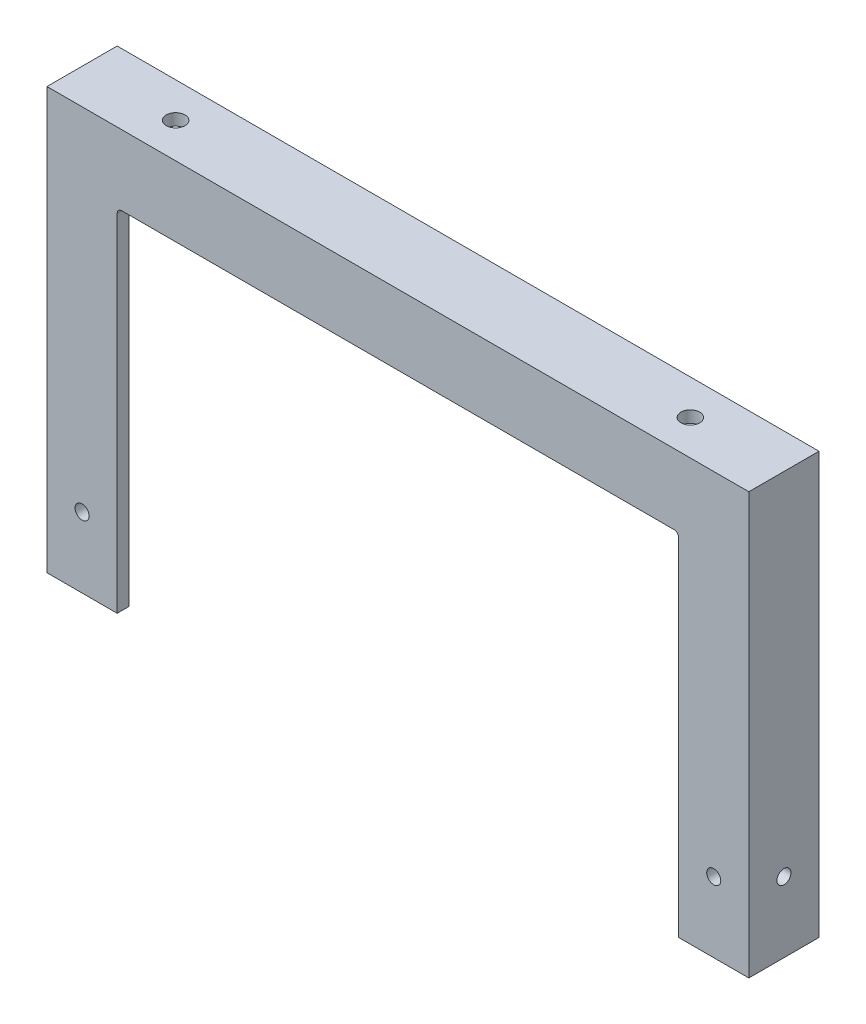
ISO-10303-21;
HEADER;
FILE_DESCRIPTION(('STEP AP214'),'2;1');
FILE_NAME('part.step','',(''),(''),'','','');
FILE_SCHEMA(('AUTOMOTIVE_DESIGN { 1 0 10303 214 1 1 1 1 }'));
ENDSEC;
DATA;
#1=APPLICATION_CONTEXT('core data for automotive mechanical design processes');
#2=APPLICATION_PROTOCOL_DEFINITION('international standard','automotive_design',2000,#1);
#3=PRODUCT_CONTEXT('',#1,'mechanical');
#4=PRODUCT('Part','Part','',(#3));
#5=PRODUCT_RELATED_PRODUCT_CATEGORY('part','',(#4));
#6=PRODUCT_DEFINITION_FORMATION('','',#4);
#7=PRODUCT_DEFINITION_CONTEXT('part definition',#1,'design');
#8=PRODUCT_DEFINITION('design','',#6,#7);
#9=PRODUCT_DEFINITION_SHAPE('','',#8);
#10=(LENGTH_UNIT() NAMED_UNIT(*) SI_UNIT(.MILLI.,.METRE.));
#11=(NAMED_UNIT(*) PLANE_ANGLE_UNIT() SI_UNIT($,.RADIAN.));
#12=(NAMED_UNIT(*) SI_UNIT($,.STERADIAN.) SOLID_ANGLE_UNIT());
#13=UNCERTAINTY_MEASURE_WITH_UNIT(LENGTH_MEASURE(1.E-05),#10,'distance_accuracy_value','');
#14=(GEOMETRIC_REPRESENTATION_CONTEXT(3) GLOBAL_UNCERTAINTY_ASSIGNED_CONTEXT((#13)) GLOBAL_UNIT_ASSIGNED_CONTEXT((#10,
#11,#12)) REPRESENTATION_CONTEXT('',''));
#15=CARTESIAN_POINT('',(0.,0.,0.));
#16=DIRECTION('',(0.,0.,1.));
#17=DIRECTION('',(1.,0.,0.));
#18=AXIS2_PLACEMENT_3D('',#15,#16,#17);
#19=CARTESIAN_POINT('',(30.,0.,25.));
#20=DIRECTION('',(0.,1.,0.));
#21=DIRECTION('',(0.,0.,1.));
#22=AXIS2_PLACEMENT_3D('',#19,#20,#21);
#23=PLANE('',#22);
#24=DIRECTION('',(0.,0.,-1.));
#25=VECTOR('',#24,1.);
#26=CARTESIAN_POINT('',(0.,0.,25.));
#27=LINE('',#26,#25);
#28=CARTESIAN_POINT('',(0.,0.,25.));
#29=VERTEX_POINT('',#28);
#30=CARTESIAN_POINT('',(0.,0.,-5.));
#31=VERTEX_POINT('',#30);
#32=EDGE_CURVE('E277',#29,#31,#27,.T.);
#33=ORIENTED_EDGE('',*,*,#32,.T.);
#34=DIRECTION('',(-1.,0.,0.));
#35=VECTOR('',#34,1.);
#36=CARTESIAN_POINT('',(0.,0.,-5.));
#37=LINE('',#36,#35);
#38=CARTESIAN_POINT('',(5.,0.,-5.));
#39=VERTEX_POINT('',#38);
#40=EDGE_CURVE('E207',#39,#31,#37,.T.);
#41=ORIENTED_EDGE('',*,*,#40,.F.);
#42=DIRECTION('',(0.,0.,-1.));
#43=VECTOR('',#42,1.);
#44=CARTESIAN_POINT('',(5.,0.,20.));
#45=LINE('',#44,#43);
#46=CARTESIAN_POINT('',(5.,0.,18.));
#47=VERTEX_POINT('',#46);
#48=EDGE_CURVE('E175',#47,#39,#45,.T.);
#49=ORIENTED_EDGE('',*,*,#48,.F.);
#50=CARTESIAN_POINT('',(7.,0.,18.));
#51=DIRECTION('',(0.,1.,0.));
#52=DIRECTION('',(0.,0.,1.));
#53=AXIS2_PLACEMENT_3D('',#50,#51,#52);
#54=CIRCLE('',#53,2.);
#55=CARTESIAN_POINT('',(7.,0.,20.));
#56=VERTEX_POINT('',#55);
#57=EDGE_CURVE('E366',#47,#56,#54,.T.);
#58=ORIENTED_EDGE('',*,*,#57,.T.);
#59=DIRECTION('',(-1.,0.,0.));
#60=VECTOR('',#59,1.);
#61=CARTESIAN_POINT('',(5.,0.,20.));
#62=LINE('',#61,#60);
#63=CARTESIAN_POINT('',(30.,0.,20.));
#64=VERTEX_POINT('',#63);
#65=EDGE_CURVE('E176',#64,#56,#62,.T.);
#66=ORIENTED_EDGE('',*,*,#65,.F.);
#67=DIRECTION('',(0.,0.,-1.));
#68=VECTOR('',#67,1.);
#69=CARTESIAN_POINT('',(30.,0.,25.));
#70=LINE('',#69,#68);
#71=CARTESIAN_POINT('',(30.,0.,25.));
#72=VERTEX_POINT('',#71);
#73=EDGE_CURVE('E293',#72,#64,#70,.T.);
#74=ORIENTED_EDGE('',*,*,#73,.F.);
#75=DIRECTION('',(1.,0.,0.));
#76=VECTOR('',#75,1.);
#77=CARTESIAN_POINT('',(30.,0.,25.));
#78=LINE('',#77,#76);
#79=EDGE_CURVE('E249',#29,#72,#78,.T.);
#80=ORIENTED_EDGE('',*,*,#79,.F.);
#81=EDGE_LOOP('',(#33,#41,#49,#58,#66,#74,#80));
#82=FACE_BOUND('',#81,.T.);
#83=ADVANCED_FACE('F43',(#82),#23,.F.);
#84=CARTESIAN_POINT('',(30.,150.,25.));
#85=DIRECTION('',(-1.,0.,0.));
#86=DIRECTION('',(0.,0.,1.));
#87=AXIS2_PLACEMENT_3D('',#84,#85,#86);
#88=PLANE('',#87);
#89=DIRECTION('',(0.,-1.,0.));
#90=VECTOR('',#89,1.);
#91=CARTESIAN_POINT('',(30.,0.,20.));
#92=LINE('',#91,#90);
#93=CARTESIAN_POINT('',(30.,148.,20.));
#94=VERTEX_POINT('',#93);
#95=EDGE_CURVE('E241',#94,#64,#92,.T.);
#96=ORIENTED_EDGE('',*,*,#95,.F.);
#97=DIRECTION('',(0.,0.,-1.));
#98=VECTOR('',#97,1.);
#99=CARTESIAN_POINT('',(30.,148.,25.));
#100=LINE('',#99,#98);
#101=CARTESIAN_POINT('',(30.,148.,25.));
#102=VERTEX_POINT('',#101);
#103=EDGE_CURVE('E319',#94,#102,#100,.F.);
#104=ORIENTED_EDGE('',*,*,#103,.T.);
#105=DIRECTION('',(0.,1.,0.));
#106=VECTOR('',#105,1.);
#107=CARTESIAN_POINT('',(30.,150.,25.));
#108=LINE('',#107,#106);
#109=EDGE_CURVE('E254',#72,#102,#108,.T.);
#110=ORIENTED_EDGE('',*,*,#109,.F.);
#111=ORIENTED_EDGE('',*,*,#73,.T.);
#112=EDGE_LOOP('',(#96,#104,#110,#111));
#113=FACE_BOUND('',#112,.T.);
#114=ADVANCED_FACE('F438',(#113),#88,.F.);
#115=CARTESIAN_POINT('',(270.,150.,25.));
#116=DIRECTION('',(0.,1.,0.));
#117=DIRECTION('',(-1.,0.,0.));
#118=AXIS2_PLACEMENT_3D('',#115,#116,#117);
#119=PLANE('',#118);
#120=DIRECTION('',(-1.,0.,0.));
#121=VECTOR('',#120,1.);
#122=CARTESIAN_POINT('',(30.,150.,20.));
#123=LINE('',#122,#121);
#124=CARTESIAN_POINT('',(268.,150.,20.));
#125=VERTEX_POINT('',#124);
#126=CARTESIAN_POINT('',(32.,150.,20.));
#127=VERTEX_POINT('',#126);
#128=EDGE_CURVE('E237',#125,#127,#123,.T.);
#129=ORIENTED_EDGE('',*,*,#128,.F.);
#130=DIRECTION('',(0.,0.,-1.));
#131=VECTOR('',#130,1.);
#132=CARTESIAN_POINT('',(268.,150.,25.));
#133=LINE('',#132,#131);
#134=CARTESIAN_POINT('',(268.,150.,25.));
#135=VERTEX_POINT('',#134);
#136=EDGE_CURVE('E316',#125,#135,#133,.F.);
#137=ORIENTED_EDGE('',*,*,#136,.T.);
#138=DIRECTION('',(1.,0.,0.));
#139=VECTOR('',#138,1.);
#140=CARTESIAN_POINT('',(270.,150.,25.));
#141=LINE('',#140,#139);
#142=CARTESIAN_POINT('',(32.0000000000001,150.,25.));
#143=VERTEX_POINT('',#142);
#144=EDGE_CURVE('E258',#143,#135,#141,.T.);
#145=ORIENTED_EDGE('',*,*,#144,.F.);
#146=DIRECTION('',(0.,0.,-1.));
#147=VECTOR('',#146,1.);
#148=CARTESIAN_POINT('',(32.,150.,20.));
#149=LINE('',#148,#147);
#150=EDGE_CURVE('E312',#143,#127,#149,.T.);
#151=ORIENTED_EDGE('',*,*,#150,.T.);
#152=EDGE_LOOP('',(#129,#137,#145,#151));
#153=FACE_BOUND('',#152,.T.);
#154=ADVANCED_FACE('F444',(#153),#119,.F.);
#155=CARTESIAN_POINT('',(270.,0.,25.));
#156=DIRECTION('',(1.,0.,0.));
#157=DIRECTION('',(0.,0.,-1.));
#158=AXIS2_PLACEMENT_3D('',#155,#156,#157);
#159=PLANE('',#158);
#160=DIRECTION('',(0.,-1.,0.));
#161=VECTOR('',#160,1.);
#162=CARTESIAN_POINT('',(270.,0.,25.));
#163=LINE('',#162,#161);
#164=CARTESIAN_POINT('',(270.,148.,25.));
#165=VERTEX_POINT('',#164);
#166=CARTESIAN_POINT('',(270.,0.,25.));
#167=VERTEX_POINT('',#166);
#168=EDGE_CURVE('E262',#165,#167,#163,.T.);
#169=ORIENTED_EDGE('',*,*,#168,.F.);
#170=DIRECTION('',(0.,0.,-1.));
#171=VECTOR('',#170,1.);
#172=CARTESIAN_POINT('',(270.,148.,20.));
#173=LINE('',#172,#171);
#174=CARTESIAN_POINT('',(270.,148.,20.));
#175=VERTEX_POINT('',#174);
#176=EDGE_CURVE('E297',#165,#175,#173,.T.);
#177=ORIENTED_EDGE('',*,*,#176,.T.);
#178=DIRECTION('',(0.,1.,0.));
#179=VECTOR('',#178,1.);
#180=CARTESIAN_POINT('',(270.,150.,20.));
#181=LINE('',#180,#179);
#182=CARTESIAN_POINT('',(270.,0.,20.));
#183=VERTEX_POINT('',#182);
#184=EDGE_CURVE('E232',#183,#175,#181,.T.);
#185=ORIENTED_EDGE('',*,*,#184,.F.);
#186=DIRECTION('',(0.,0.,-1.));
#187=VECTOR('',#186,1.);
#188=CARTESIAN_POINT('',(270.,0.,25.));
#189=LINE('',#188,#187);
#190=EDGE_CURVE('E289',#167,#183,#189,.T.);
#191=ORIENTED_EDGE('',*,*,#190,.F.);
#192=EDGE_LOOP('',(#169,#177,#185,#191));
#193=FACE_BOUND('',#192,.T.);
#194=ADVANCED_FACE('F519',(#193),#159,.F.);
#195=CARTESIAN_POINT('',(300.,0.,25.));
#196=DIRECTION('',(0.,1.,0.));
#197=DIRECTION('',(-1.,0.,0.));
#198=AXIS2_PLACEMENT_3D('',#195,#196,#197);
#199=PLANE('',#198);
#200=DIRECTION('',(-1.,0.,0.));
#201=VECTOR('',#200,1.);
#202=CARTESIAN_POINT('',(270.,0.,20.));
#203=LINE('',#202,#201);
#204=CARTESIAN_POINT('',(293.,0.,20.));
#205=VERTEX_POINT('',#204);
#206=EDGE_CURVE('E229',#205,#183,#203,.T.);
#207=ORIENTED_EDGE('',*,*,#206,.F.);
#208=CARTESIAN_POINT('',(293.,0.,18.));
#209=DIRECTION('',(0.,1.,0.));
#210=DIRECTION('',(-1.,0.,0.));
#211=AXIS2_PLACEMENT_3D('',#208,#209,#210);
#212=CIRCLE('',#211,2.);
#213=CARTESIAN_POINT('',(295.,0.,18.));
#214=VERTEX_POINT('',#213);
#215=EDGE_CURVE('E53',#205,#214,#212,.T.);
#216=ORIENTED_EDGE('',*,*,#215,.T.);
#217=DIRECTION('',(0.,0.,-1.));
#218=VECTOR('',#217,1.);
#219=CARTESIAN_POINT('',(295.,0.,20.));
#220=LINE('',#219,#218);
#221=CARTESIAN_POINT('',(295.,0.,-5.));
#222=VERTEX_POINT('',#221);
#223=EDGE_CURVE('E168',#214,#222,#220,.T.);
#224=ORIENTED_EDGE('',*,*,#223,.T.);
#225=DIRECTION('',(-1.,0.,0.));
#226=VECTOR('',#225,1.);
#227=CARTESIAN_POINT('',(295.,0.,-5.));
#228=LINE('',#227,#226);
#229=CARTESIAN_POINT('',(300.,0.,-5.));
#230=VERTEX_POINT('',#229);
#231=EDGE_CURVE('E173',#230,#222,#228,.T.);
#232=ORIENTED_EDGE('',*,*,#231,.F.);
#233=DIRECTION('',(0.,0.,-1.));
#234=VECTOR('',#233,1.);
#235=CARTESIAN_POINT('',(300.,0.,25.));
#236=LINE('',#235,#234);
#237=CARTESIAN_POINT('',(300.,0.,25.));
#238=VERTEX_POINT('',#237);
#239=EDGE_CURVE('E286',#238,#230,#236,.T.);
#240=ORIENTED_EDGE('',*,*,#239,.F.);
#241=DIRECTION('',(1.,0.,0.));
#242=VECTOR('',#241,1.);
#243=CARTESIAN_POINT('',(300.,0.,25.));
#244=LINE('',#243,#242);
#245=EDGE_CURVE('E265',#167,#238,#244,.T.);
#246=ORIENTED_EDGE('',*,*,#245,.F.);
#247=ORIENTED_EDGE('',*,*,#190,.T.);
#248=EDGE_LOOP('',(#207,#216,#224,#232,#240,#246,#247));
#249=FACE_BOUND('',#248,.T.);
#250=ADVANCED_FACE('F170',(#249),#199,.F.);
#251=CARTESIAN_POINT('',(300.,180.,25.));
#252=DIRECTION('',(-1.,0.,0.));
#253=DIRECTION('',(0.,0.,1.));
#254=AXIS2_PLACEMENT_3D('',#251,#252,#253);
#255=PLANE('',#254);
#256=CARTESIAN_POINT('',(300.,30.,10.));
#257=DIRECTION('',(-1.,0.,0.));
#258=DIRECTION('',(0.,0.,1.));
#259=AXIS2_PLACEMENT_3D('',#256,#257,#258);
#260=CIRCLE('',#259,3.);
#261=CARTESIAN_POINT('',(300.,30.,13.));
#262=VERTEX_POINT('',#261);
#263=EDGE_CURVE('E193',#262,#262,#260,.T.);
#264=ORIENTED_EDGE('',*,*,#263,.T.);
#265=EDGE_LOOP('',(#264));
#266=FACE_BOUND('',#265,.T.);
#267=ORIENTED_EDGE('',*,*,#239,.T.);
#268=DIRECTION('',(0.,-1.,0.));
#269=VECTOR('',#268,1.);
#270=CARTESIAN_POINT('',(300.,0.,-5.));
#271=LINE('',#270,#269);
#272=CARTESIAN_POINT('',(300.,180.,-5.));
#273=VERTEX_POINT('',#272);
#274=EDGE_CURVE('E191',#273,#230,#271,.T.);
#275=ORIENTED_EDGE('',*,*,#274,.F.);
#276=DIRECTION('',(0.,0.,-1.));
#277=VECTOR('',#276,1.);
#278=CARTESIAN_POINT('',(300.,180.,25.));
#279=LINE('',#278,#277);
#280=CARTESIAN_POINT('',(300.,180.,25.));
#281=VERTEX_POINT('',#280);
#282=EDGE_CURVE('E283',#281,#273,#279,.T.);
#283=ORIENTED_EDGE('',*,*,#282,.F.);
#284=DIRECTION('',(0.,1.,0.));
#285=VECTOR('',#284,1.);
#286=CARTESIAN_POINT('',(300.,180.,25.));
#287=LINE('',#286,#285);
#288=EDGE_CURVE('E268',#238,#281,#287,.T.);
#289=ORIENTED_EDGE('',*,*,#288,.F.);
#290=EDGE_LOOP('',(#267,#275,#283,#289));
#291=FACE_BOUND('',#290,.T.);
#292=ADVANCED_FACE('F508',(#266,#291),#255,.F.);
#293=CARTESIAN_POINT('',(0.,180.,25.));
#294=DIRECTION('',(0.,-1.,0.));
#295=DIRECTION('',(0.,0.,-1.));
#296=AXIS2_PLACEMENT_3D('',#293,#294,#295);
#297=PLANE('',#296);
#298=CARTESIAN_POINT('',(40.,180.,10.));
#299=DIRECTION('',(0.,1.,0.));
#300=DIRECTION('',(0.,0.,1.));
#301=AXIS2_PLACEMENT_3D('',#298,#299,#300);
#302=CIRCLE('',#301,4.);
#303=CARTESIAN_POINT('',(40.,180.,14.));
#304=VERTEX_POINT('',#303);
#305=EDGE_CURVE('E397',#304,#304,#302,.T.);
#306=ORIENTED_EDGE('',*,*,#305,.F.);
#307=EDGE_LOOP('',(#306));
#308=FACE_BOUND('',#307,.T.);
#309=CARTESIAN_POINT('',(260.,180.,10.));
#310=DIRECTION('',(0.,1.,0.));
#311=DIRECTION('',(0.,0.,1.));
#312=AXIS2_PLACEMENT_3D('',#309,#310,#311);
#313=CIRCLE('',#312,3.99999999999999);
#314=CARTESIAN_POINT('',(260.,180.,14.));
#315=VERTEX_POINT('',#314);
#316=EDGE_CURVE('E404',#315,#315,#313,.T.);
#317=ORIENTED_EDGE('',*,*,#316,.F.);
#318=EDGE_LOOP('',(#317));
#319=FACE_BOUND('',#318,.T.);
#320=ORIENTED_EDGE('',*,*,#282,.T.);
#321=DIRECTION('',(1.,0.,0.));
#322=VECTOR('',#321,1.);
#323=CARTESIAN_POINT('',(300.,180.,-5.));
#324=LINE('',#323,#322);
#325=CARTESIAN_POINT('',(0.,180.,-5.));
#326=VERTEX_POINT('',#325);
#327=EDGE_CURVE('E215',#326,#273,#324,.T.);
#328=ORIENTED_EDGE('',*,*,#327,.F.);
#329=DIRECTION('',(0.,0.,-1.));
#330=VECTOR('',#329,1.);
#331=CARTESIAN_POINT('',(0.,180.,25.));
#332=LINE('',#331,#330);
#333=CARTESIAN_POINT('',(0.,180.,25.));
#334=VERTEX_POINT('',#333);
#335=EDGE_CURVE('E280',#334,#326,#332,.T.);
#336=ORIENTED_EDGE('',*,*,#335,.F.);
#337=DIRECTION('',(-1.,0.,0.));
#338=VECTOR('',#337,1.);
#339=CARTESIAN_POINT('',(0.,180.,25.));
#340=LINE('',#339,#338);
#341=EDGE_CURVE('E271',#281,#334,#340,.T.);
#342=ORIENTED_EDGE('',*,*,#341,.F.);
#343=EDGE_LOOP('',(#320,#328,#336,#342));
#344=FACE_BOUND('',#343,.T.);
#345=ADVANCED_FACE('F505',(#308,#319,#344),#297,.F.);
#346=CARTESIAN_POINT('',(0.,0.,25.));
#347=DIRECTION('',(1.,0.,0.));
#348=DIRECTION('',(0.,0.,-1.));
#349=AXIS2_PLACEMENT_3D('',#346,#347,#348);
#350=PLANE('',#349);
#351=CARTESIAN_POINT('',(0.,30.,10.));
#352=DIRECTION('',(-1.,0.,0.));
#353=DIRECTION('',(0.,0.,1.));
#354=AXIS2_PLACEMENT_3D('',#351,#352,#353);
#355=CIRCLE('',#354,3.);
#356=CARTESIAN_POINT('',(0.,30.,13.));
#357=VERTEX_POINT('',#356);
#358=EDGE_CURVE('E308',#357,#357,#355,.T.);
#359=ORIENTED_EDGE('',*,*,#358,.F.);
#360=EDGE_LOOP('',(#359));
#361=FACE_BOUND('',#360,.T.);
#362=ORIENTED_EDGE('',*,*,#335,.T.);
#363=DIRECTION('',(0.,1.,0.));
#364=VECTOR('',#363,1.);
#365=CARTESIAN_POINT('',(0.,180.,-5.));
#366=LINE('',#365,#364);
#367=EDGE_CURVE('E211',#31,#326,#366,.T.);
#368=ORIENTED_EDGE('',*,*,#367,.F.);
#369=ORIENTED_EDGE('',*,*,#32,.F.);
#370=DIRECTION('',(0.,-1.,0.));
#371=VECTOR('',#370,1.);
#372=CARTESIAN_POINT('',(0.,0.,25.));
#373=LINE('',#372,#371);
#374=EDGE_CURVE('E274',#334,#29,#373,.T.);
#375=ORIENTED_EDGE('',*,*,#374,.F.);
#376=EDGE_LOOP('',(#362,#368,#369,#375));
#377=FACE_BOUND('',#376,.T.);
#378=ADVANCED_FACE('F500',(#361,#377),#350,.F.);
#379=CARTESIAN_POINT('',(0.,0.,25.));
#380=DIRECTION('',(0.,0.,-1.));
#381=DIRECTION('',(-1.,0.,0.));
#382=AXIS2_PLACEMENT_3D('',#379,#380,#381);
#383=PLANE('',#382);
#384=CARTESIAN_POINT('',(15.,30.,25.));
#385=DIRECTION('',(0.,0.,1.));
#386=DIRECTION('',(1.,0.,0.));
#387=AXIS2_PLACEMENT_3D('',#384,#385,#386);
#388=CIRCLE('',#387,3.);
#389=CARTESIAN_POINT('',(18.,30.,25.));
#390=VERTEX_POINT('',#389);
#391=EDGE_CURVE('E221',#390,#390,#388,.T.);
#392=ORIENTED_EDGE('',*,*,#391,.F.);
#393=EDGE_LOOP('',(#392));
#394=FACE_BOUND('',#393,.T.);
#395=CARTESIAN_POINT('',(285.,30.,25.));
#396=DIRECTION('',(0.,0.,1.));
#397=DIRECTION('',(1.,0.,0.));
#398=AXIS2_PLACEMENT_3D('',#395,#396,#397);
#399=CIRCLE('',#398,2.99999999999999);
#400=CARTESIAN_POINT('',(288.,30.,25.));
#401=VERTEX_POINT('',#400);
#402=EDGE_CURVE('E220',#401,#401,#399,.T.);
#403=ORIENTED_EDGE('',*,*,#402,.F.);
#404=EDGE_LOOP('',(#403));
#405=FACE_BOUND('',#404,.T.);
#406=ORIENTED_EDGE('',*,*,#79,.T.);
#407=ORIENTED_EDGE('',*,*,#109,.T.);
#408=CARTESIAN_POINT('',(32.,148.,25.));
#409=DIRECTION('',(0.,0.,-1.));
#410=DIRECTION('',(-1.,0.,0.));
#411=AXIS2_PLACEMENT_3D('',#408,#409,#410);
#412=CIRCLE('',#411,2.);
#413=EDGE_CURVE('E360',#102,#143,#412,.T.);
#414=ORIENTED_EDGE('',*,*,#413,.T.);
#415=ORIENTED_EDGE('',*,*,#144,.T.);
#416=CARTESIAN_POINT('',(268.,148.,25.));
#417=DIRECTION('',(0.,0.,-1.));
#418=DIRECTION('',(-1.,0.,0.));
#419=AXIS2_PLACEMENT_3D('',#416,#417,#418);
#420=CIRCLE('',#419,2.);
#421=EDGE_CURVE('E354',#135,#165,#420,.T.);
#422=ORIENTED_EDGE('',*,*,#421,.T.);
#423=ORIENTED_EDGE('',*,*,#168,.T.);
#424=ORIENTED_EDGE('',*,*,#245,.T.);
#425=ORIENTED_EDGE('',*,*,#288,.T.);
#426=ORIENTED_EDGE('',*,*,#341,.T.);
#427=ORIENTED_EDGE('',*,*,#374,.T.);
#428=EDGE_LOOP('',(#406,#407,#414,#415,#422,#423,#424,#425,#426,#427));
#429=FACE_BOUND('',#428,.T.);
#430=ADVANCED_FACE('F513',(#394,#405,#429),#383,.F.);
#431=CARTESIAN_POINT('',(5.,175.,20.));
#432=DIRECTION('',(-1.,0.,0.));
#433=DIRECTION('',(0.,0.,1.));
#434=AXIS2_PLACEMENT_3D('',#431,#432,#433);
#435=PLANE('',#434);
#436=CARTESIAN_POINT('',(5.,30.,10.));
#437=DIRECTION('',(-1.,0.,0.));
#438=DIRECTION('',(0.,0.,1.));
#439=AXIS2_PLACEMENT_3D('',#436,#437,#438);
#440=CIRCLE('',#439,3.);
#441=CARTESIAN_POINT('',(5.,30.,13.));
#442=VERTEX_POINT('',#441);
#443=EDGE_CURVE('E197',#442,#442,#440,.T.);
#444=ORIENTED_EDGE('',*,*,#443,.T.);
#445=EDGE_LOOP('',(#444));
#446=FACE_BOUND('',#445,.T.);
#447=DIRECTION('',(0.,-1.,0.));
#448=VECTOR('',#447,1.);
#449=CARTESIAN_POINT('',(5.,0.,-5.));
#450=LINE('',#449,#448);
#451=CARTESIAN_POINT('',(5.,173.,-5.));
#452=VERTEX_POINT('',#451);
#453=EDGE_CURVE('E204',#452,#39,#450,.T.);
#454=ORIENTED_EDGE('',*,*,#453,.F.);
#455=DIRECTION('',(0.,0.,-1.));
#456=VECTOR('',#455,1.);
#457=CARTESIAN_POINT('',(5.,173.,20.));
#458=LINE('',#457,#456);
#459=CARTESIAN_POINT('',(5.,173.,18.));
#460=VERTEX_POINT('',#459);
#461=EDGE_CURVE('E335',#452,#460,#458,.F.);
#462=ORIENTED_EDGE('',*,*,#461,.T.);
#463=DIRECTION('',(0.,1.,0.));
#464=VECTOR('',#463,1.);
#465=CARTESIAN_POINT('',(5.,0.,18.));
#466=LINE('',#465,#464);
#467=EDGE_CURVE('E332',#460,#47,#466,.F.);
#468=ORIENTED_EDGE('',*,*,#467,.T.);
#469=ORIENTED_EDGE('',*,*,#48,.T.);
#470=EDGE_LOOP('',(#454,#462,#468,#469));
#471=FACE_BOUND('',#470,.T.);
#472=ADVANCED_FACE('F418',(#446,#471),#435,.F.);
#473=CARTESIAN_POINT('',(295.,0.,20.));
#474=DIRECTION('',(1.,0.,0.));
#475=DIRECTION('',(0.,0.,-1.));
#476=AXIS2_PLACEMENT_3D('',#473,#474,#475);
#477=PLANE('',#476);
#478=CARTESIAN_POINT('',(295.,30.,10.));
#479=DIRECTION('',(1.,0.,0.));
#480=DIRECTION('',(0.,0.,-1.));
#481=AXIS2_PLACEMENT_3D('',#478,#479,#480);
#482=CIRCLE('',#481,3.);
#483=CARTESIAN_POINT('',(295.,30.,7.));
#484=VERTEX_POINT('',#483);
#485=EDGE_CURVE('E304',#484,#484,#482,.T.);
#486=ORIENTED_EDGE('',*,*,#485,.T.);
#487=EDGE_LOOP('',(#486));
#488=FACE_BOUND('',#487,.T.);
#489=ORIENTED_EDGE('',*,*,#223,.F.);
#490=DIRECTION('',(0.,-1.,0.));
#491=VECTOR('',#490,1.);
#492=CARTESIAN_POINT('',(295.,175.,18.));
#493=LINE('',#492,#491);
#494=CARTESIAN_POINT('',(295.,173.,18.));
#495=VERTEX_POINT('',#494);
#496=EDGE_CURVE('E61',#214,#495,#493,.F.);
#497=ORIENTED_EDGE('',*,*,#496,.T.);
#498=DIRECTION('',(0.,0.,-1.));
#499=VECTOR('',#498,1.);
#500=CARTESIAN_POINT('',(295.,173.,-5.));
#501=LINE('',#500,#499);
#502=CARTESIAN_POINT('',(295.,173.,-5.));
#503=VERTEX_POINT('',#502);
#504=EDGE_CURVE('E181',#495,#503,#501,.T.);
#505=ORIENTED_EDGE('',*,*,#504,.T.);
#506=DIRECTION('',(0.,1.,0.));
#507=VECTOR('',#506,1.);
#508=CARTESIAN_POINT('',(295.,175.,-5.));
#509=LINE('',#508,#507);
#510=EDGE_CURVE('E179',#222,#503,#509,.T.);
#511=ORIENTED_EDGE('',*,*,#510,.F.);
#512=EDGE_LOOP('',(#489,#497,#505,#511));
#513=FACE_BOUND('',#512,.T.);
#514=ADVANCED_FACE('F180',(#488,#513),#477,.F.);
#515=CARTESIAN_POINT('',(295.,175.,20.));
#516=DIRECTION('',(0.,1.,0.));
#517=DIRECTION('',(0.,0.,1.));
#518=AXIS2_PLACEMENT_3D('',#515,#516,#517);
#519=PLANE('',#518);
#520=CARTESIAN_POINT('',(40.,175.,10.));
#521=DIRECTION('',(0.,1.,0.));
#522=DIRECTION('',(0.,0.,1.));
#523=AXIS2_PLACEMENT_3D('',#520,#521,#522);
#524=CIRCLE('',#523,4.);
#525=CARTESIAN_POINT('',(40.,175.,14.));
#526=VERTEX_POINT('',#525);
#527=EDGE_CURVE('E47',#526,#526,#524,.T.);
#528=ORIENTED_EDGE('',*,*,#527,.T.);
#529=EDGE_LOOP('',(#528));
#530=FACE_BOUND('',#529,.T.);
#531=CARTESIAN_POINT('',(260.,175.,10.));
#532=DIRECTION('',(0.,1.,0.));
#533=DIRECTION('',(0.,0.,1.));
#534=AXIS2_PLACEMENT_3D('',#531,#532,#533);
#535=CIRCLE('',#534,3.99999999999999);
#536=CARTESIAN_POINT('',(260.,175.,14.));
#537=VERTEX_POINT('',#536);
#538=EDGE_CURVE('E394',#537,#537,#535,.T.);
#539=ORIENTED_EDGE('',*,*,#538,.T.);
#540=EDGE_LOOP('',(#539));
#541=FACE_BOUND('',#540,.T.);
#542=DIRECTION('',(1.,0.,0.));
#543=VECTOR('',#542,1.);
#544=CARTESIAN_POINT('',(5.,175.,18.));
#545=LINE('',#544,#543);
#546=CARTESIAN_POINT('',(293.,175.,18.));
#547=VERTEX_POINT('',#546);
#548=CARTESIAN_POINT('',(7.00000000000001,175.,18.));
#549=VERTEX_POINT('',#548);
#550=EDGE_CURVE('E322',#547,#549,#545,.F.);
#551=ORIENTED_EDGE('',*,*,#550,.T.);
#552=DIRECTION('',(0.,0.,-1.));
#553=VECTOR('',#552,1.);
#554=CARTESIAN_POINT('',(7.00000000000001,175.,-5.));
#555=LINE('',#554,#553);
#556=CARTESIAN_POINT('',(7.00000000000001,175.,-5.));
#557=VERTEX_POINT('',#556);
#558=EDGE_CURVE('E328',#549,#557,#555,.T.);
#559=ORIENTED_EDGE('',*,*,#558,.T.);
#560=DIRECTION('',(-1.,0.,0.));
#561=VECTOR('',#560,1.);
#562=CARTESIAN_POINT('',(5.,175.,-5.));
#563=LINE('',#562,#561);
#564=CARTESIAN_POINT('',(293.,175.,-5.));
#565=VERTEX_POINT('',#564);
#566=EDGE_CURVE('E185',#565,#557,#563,.T.);
#567=ORIENTED_EDGE('',*,*,#566,.F.);
#568=DIRECTION('',(0.,0.,-1.));
#569=VECTOR('',#568,1.);
#570=CARTESIAN_POINT('',(293.,175.,20.));
#571=LINE('',#570,#569);
#572=EDGE_CURVE('E325',#565,#547,#571,.F.);
#573=ORIENTED_EDGE('',*,*,#572,.T.);
#574=EDGE_LOOP('',(#551,#559,#567,#573));
#575=FACE_BOUND('',#574,.T.);
#576=ADVANCED_FACE('F484',(#530,#541,#575),#519,.F.);
#577=CARTESIAN_POINT('',(0.,0.,20.));
#578=DIRECTION('',(0.,0.,1.));
#579=DIRECTION('',(1.,0.,0.));
#580=AXIS2_PLACEMENT_3D('',#577,#578,#579);
#581=PLANE('',#580);
#582=ORIENTED_EDGE('',*,*,#65,.T.);
#583=DIRECTION('',(0.,1.,0.));
#584=VECTOR('',#583,1.);
#585=CARTESIAN_POINT('',(7.,175.,20.));
#586=LINE('',#585,#584);
#587=CARTESIAN_POINT('',(7.,173.,20.));
#588=VERTEX_POINT('',#587);
#589=EDGE_CURVE('E344',#56,#588,#586,.T.);
#590=ORIENTED_EDGE('',*,*,#589,.T.);
#591=DIRECTION('',(1.,0.,0.));
#592=VECTOR('',#591,1.);
#593=CARTESIAN_POINT('',(295.,173.,20.));
#594=LINE('',#593,#592);
#595=CARTESIAN_POINT('',(293.,173.,20.));
#596=VERTEX_POINT('',#595);
#597=EDGE_CURVE('E338',#588,#596,#594,.T.);
#598=ORIENTED_EDGE('',*,*,#597,.T.);
#599=DIRECTION('',(0.,-1.,0.));
#600=VECTOR('',#599,1.);
#601=CARTESIAN_POINT('',(293.,0.,20.));
#602=LINE('',#601,#600);
#603=EDGE_CURVE('E341',#596,#205,#602,.T.);
#604=ORIENTED_EDGE('',*,*,#603,.T.);
#605=ORIENTED_EDGE('',*,*,#206,.T.);
#606=ORIENTED_EDGE('',*,*,#184,.T.);
#607=CARTESIAN_POINT('',(268.,148.,20.));
#608=DIRECTION('',(0.,0.,1.));
#609=DIRECTION('',(1.,0.,0.));
#610=AXIS2_PLACEMENT_3D('',#607,#608,#609);
#611=CIRCLE('',#610,2.);
#612=EDGE_CURVE('E351',#175,#125,#611,.T.);
#613=ORIENTED_EDGE('',*,*,#612,.T.);
#614=ORIENTED_EDGE('',*,*,#128,.T.);
#615=CARTESIAN_POINT('',(32.,148.,20.));
#616=DIRECTION('',(0.,0.,1.));
#617=DIRECTION('',(1.,0.,0.));
#618=AXIS2_PLACEMENT_3D('',#615,#616,#617);
#619=CIRCLE('',#618,2.);
#620=EDGE_CURVE('E357',#127,#94,#619,.T.);
#621=ORIENTED_EDGE('',*,*,#620,.T.);
#622=ORIENTED_EDGE('',*,*,#95,.T.);
#623=EDGE_LOOP('',(#582,#590,#598,#604,#605,#606,#613,#614,#621,#622));
#624=FACE_BOUND('',#623,.T.);
#625=CARTESIAN_POINT('',(15.,30.,20.));
#626=DIRECTION('',(0.,0.,1.));
#627=DIRECTION('',(1.,0.,0.));
#628=AXIS2_PLACEMENT_3D('',#625,#626,#627);
#629=CIRCLE('',#628,3.);
#630=CARTESIAN_POINT('',(18.,30.,20.));
#631=VERTEX_POINT('',#630);
#632=EDGE_CURVE('E233',#631,#631,#629,.T.);
#633=ORIENTED_EDGE('',*,*,#632,.T.);
#634=EDGE_LOOP('',(#633));
#635=FACE_BOUND('',#634,.T.);
#636=CARTESIAN_POINT('',(285.,30.,20.));
#637=DIRECTION('',(0.,0.,1.));
#638=DIRECTION('',(1.,0.,0.));
#639=AXIS2_PLACEMENT_3D('',#636,#637,#638);
#640=CIRCLE('',#639,2.99999999999999);
#641=CARTESIAN_POINT('',(288.,30.,20.));
#642=VERTEX_POINT('',#641);
#643=EDGE_CURVE('E225',#642,#642,#640,.T.);
#644=ORIENTED_EDGE('',*,*,#643,.T.);
#645=EDGE_LOOP('',(#644));
#646=FACE_BOUND('',#645,.T.);
#647=ADVANCED_FACE('F521',(#624,#635,#646),#581,.F.);
#648=CARTESIAN_POINT('',(285.,30.,-375.));
#649=DIRECTION('',(0.,0.,1.));
#650=DIRECTION('',(1.,0.,0.));
#651=AXIS2_PLACEMENT_3D('',#648,#649,#650);
#652=CYLINDRICAL_SURFACE('',#651,2.99999999999999);
#653=ORIENTED_EDGE('',*,*,#402,.T.);
#654=EDGE_LOOP('',(#653));
#655=FACE_BOUND('',#654,.T.);
#656=ORIENTED_EDGE('',*,*,#643,.F.);
#657=EDGE_LOOP('',(#656));
#658=FACE_BOUND('',#657,.T.);
#659=ADVANCED_FACE('F568',(#655,#658),#652,.F.);
#660=CARTESIAN_POINT('',(15.,30.,-375.));
#661=DIRECTION('',(0.,0.,1.));
#662=DIRECTION('',(1.,0.,0.));
#663=AXIS2_PLACEMENT_3D('',#660,#661,#662);
#664=CYLINDRICAL_SURFACE('',#663,3.);
#665=ORIENTED_EDGE('',*,*,#391,.T.);
#666=EDGE_LOOP('',(#665));
#667=FACE_BOUND('',#666,.T.);
#668=ORIENTED_EDGE('',*,*,#632,.F.);
#669=EDGE_LOOP('',(#668));
#670=FACE_BOUND('',#669,.T.);
#671=ADVANCED_FACE('F571',(#667,#670),#664,.F.);
#672=CARTESIAN_POINT('',(0.,0.,-5.));
#673=DIRECTION('',(0.,0.,1.));
#674=DIRECTION('',(1.,0.,0.));
#675=AXIS2_PLACEMENT_3D('',#672,#673,#674);
#676=PLANE('',#675);
#677=ORIENTED_EDGE('',*,*,#231,.T.);
#678=ORIENTED_EDGE('',*,*,#510,.T.);
#679=CARTESIAN_POINT('',(293.,173.,-5.));
#680=DIRECTION('',(0.,0.,1.));
#681=DIRECTION('',(1.,0.,0.));
#682=AXIS2_PLACEMENT_3D('',#679,#680,#681);
#683=CIRCLE('',#682,2.);
#684=EDGE_CURVE('E11',#503,#565,#683,.T.);
#685=ORIENTED_EDGE('',*,*,#684,.T.);
#686=ORIENTED_EDGE('',*,*,#566,.T.);
#687=CARTESIAN_POINT('',(7.00000000000001,173.,-5.));
#688=DIRECTION('',(0.,0.,1.));
#689=DIRECTION('',(1.,0.,0.));
#690=AXIS2_PLACEMENT_3D('',#687,#688,#689);
#691=CIRCLE('',#690,2.);
#692=EDGE_CURVE('E363',#557,#452,#691,.T.);
#693=ORIENTED_EDGE('',*,*,#692,.T.);
#694=ORIENTED_EDGE('',*,*,#453,.T.);
#695=ORIENTED_EDGE('',*,*,#40,.T.);
#696=ORIENTED_EDGE('',*,*,#367,.T.);
#697=ORIENTED_EDGE('',*,*,#327,.T.);
#698=ORIENTED_EDGE('',*,*,#274,.T.);
#699=EDGE_LOOP('',(#677,#678,#685,#686,#693,#694,#695,#696,#697,#698));
#700=FACE_BOUND('',#699,.T.);
#701=ADVANCED_FACE('F188',(#700),#676,.F.);
#702=CARTESIAN_POINT('',(350.,30.,10.));
#703=DIRECTION('',(-1.,0.,0.));
#704=DIRECTION('',(0.,0.,1.));
#705=AXIS2_PLACEMENT_3D('',#702,#703,#704);
#706=CYLINDRICAL_SURFACE('',#705,3.);
#707=ORIENTED_EDGE('',*,*,#485,.F.);
#708=EDGE_LOOP('',(#707));
#709=FACE_BOUND('',#708,.T.);
#710=ORIENTED_EDGE('',*,*,#263,.F.);
#711=EDGE_LOOP('',(#710));
#712=FACE_BOUND('',#711,.T.);
#713=ADVANCED_FACE('F424',(#709,#712),#706,.F.);
#714=ORIENTED_EDGE('',*,*,#358,.T.);
#715=EDGE_LOOP('',(#714));
#716=FACE_BOUND('',#715,.T.);
#717=ORIENTED_EDGE('',*,*,#443,.F.);
#718=EDGE_LOOP('',(#717));
#719=FACE_BOUND('',#718,.T.);
#720=ADVANCED_FACE('F421',(#716,#719),#706,.F.);
#721=CARTESIAN_POINT('',(268.,148.,25.));
#722=DIRECTION('',(0.,0.,1.));
#723=DIRECTION('',(1.,0.,0.));
#724=AXIS2_PLACEMENT_3D('',#721,#722,#723);
#725=CYLINDRICAL_SURFACE('',#724,2.);
#726=ORIENTED_EDGE('',*,*,#421,.F.);
#727=ORIENTED_EDGE('',*,*,#136,.F.);
#728=ORIENTED_EDGE('',*,*,#612,.F.);
#729=ORIENTED_EDGE('',*,*,#176,.F.);
#730=EDGE_LOOP('',(#726,#727,#728,#729));
#731=FACE_BOUND('',#730,.T.);
#732=ADVANCED_FACE('F423',(#731),#725,.F.);
#733=CARTESIAN_POINT('',(32.,148.,25.));
#734=DIRECTION('',(0.,0.,1.));
#735=DIRECTION('',(1.,0.,0.));
#736=AXIS2_PLACEMENT_3D('',#733,#734,#735);
#737=CYLINDRICAL_SURFACE('',#736,2.);
#738=ORIENTED_EDGE('',*,*,#413,.F.);
#739=ORIENTED_EDGE('',*,*,#103,.F.);
#740=ORIENTED_EDGE('',*,*,#620,.F.);
#741=ORIENTED_EDGE('',*,*,#150,.F.);
#742=EDGE_LOOP('',(#738,#739,#740,#741));
#743=FACE_BOUND('',#742,.T.);
#744=ADVANCED_FACE('F431',(#743),#737,.F.);
#745=CARTESIAN_POINT('',(293.,0.,18.));
#746=DIRECTION('',(0.,1.,0.));
#747=DIRECTION('',(0.,0.,1.));
#748=AXIS2_PLACEMENT_3D('',#745,#746,#747);
#749=CYLINDRICAL_SURFACE('',#748,2.);
#750=ORIENTED_EDGE('',*,*,#215,.F.);
#751=ORIENTED_EDGE('',*,*,#603,.F.);
#752=CARTESIAN_POINT('',(293.,173.,18.));
#753=DIRECTION('',(0.,-1.,0.));
#754=DIRECTION('',(0.,0.,-1.));
#755=AXIS2_PLACEMENT_3D('',#752,#753,#754);
#756=CIRCLE('',#755,2.);
#757=EDGE_CURVE('E391',#495,#596,#756,.T.);
#758=ORIENTED_EDGE('',*,*,#757,.F.);
#759=ORIENTED_EDGE('',*,*,#496,.F.);
#760=EDGE_LOOP('',(#750,#751,#758,#759));
#761=FACE_BOUND('',#760,.T.);
#762=ADVANCED_FACE('F45',(#761),#749,.F.);
#763=CARTESIAN_POINT('',(293.,173.,20.));
#764=DIRECTION('',(0.,0.,1.));
#765=DIRECTION('',(1.,0.,0.));
#766=AXIS2_PLACEMENT_3D('',#763,#764,#765);
#767=CYLINDRICAL_SURFACE('',#766,2.);
#768=ORIENTED_EDGE('',*,*,#684,.F.);
#769=ORIENTED_EDGE('',*,*,#504,.F.);
#770=CARTESIAN_POINT('',(293.,173.,18.));
#771=DIRECTION('',(0.,0.,-1.));
#772=DIRECTION('',(-1.,0.,0.));
#773=AXIS2_PLACEMENT_3D('',#770,#771,#772);
#774=CIRCLE('',#773,2.);
#775=EDGE_CURVE('E387',#547,#495,#774,.T.);
#776=ORIENTED_EDGE('',*,*,#775,.F.);
#777=ORIENTED_EDGE('',*,*,#572,.F.);
#778=EDGE_LOOP('',(#768,#769,#776,#777));
#779=FACE_BOUND('',#778,.T.);
#780=ADVANCED_FACE('F471',(#779),#767,.F.);
#781=CARTESIAN_POINT('',(293.,173.,18.));
#782=DIRECTION('',(1.,0.,0.));
#783=DIRECTION('',(0.,0.,-1.));
#784=AXIS2_PLACEMENT_3D('',#781,#782,#783);
#785=SPHERICAL_SURFACE('',#784,2.);
#786=ORIENTED_EDGE('',*,*,#775,.T.);
#787=ORIENTED_EDGE('',*,*,#757,.T.);
#788=CARTESIAN_POINT('',(293.,173.,18.));
#789=DIRECTION('',(-1.,0.,0.));
#790=DIRECTION('',(0.,0.,1.));
#791=AXIS2_PLACEMENT_3D('',#788,#789,#790);
#792=CIRCLE('',#791,2.);
#793=EDGE_CURVE('E383',#547,#596,#792,.F.);
#794=ORIENTED_EDGE('',*,*,#793,.F.);
#795=EDGE_LOOP('',(#786,#787,#794));
#796=FACE_BOUND('',#795,.T.);
#797=ADVANCED_FACE('F468',(#796),#785,.F.);
#798=CARTESIAN_POINT('',(7.,0.,18.));
#799=DIRECTION('',(0.,-1.,0.));
#800=DIRECTION('',(0.,0.,-1.));
#801=AXIS2_PLACEMENT_3D('',#798,#799,#800);
#802=CYLINDRICAL_SURFACE('',#801,2.);
#803=ORIENTED_EDGE('',*,*,#57,.F.);
#804=ORIENTED_EDGE('',*,*,#467,.F.);
#805=CARTESIAN_POINT('',(7.,173.,18.));
#806=DIRECTION('',(0.,-1.,0.));
#807=DIRECTION('',(0.,0.,-1.));
#808=AXIS2_PLACEMENT_3D('',#805,#806,#807);
#809=CIRCLE('',#808,2.);
#810=EDGE_CURVE('E379',#588,#460,#809,.T.);
#811=ORIENTED_EDGE('',*,*,#810,.F.);
#812=ORIENTED_EDGE('',*,*,#589,.F.);
#813=EDGE_LOOP('',(#803,#804,#811,#812));
#814=FACE_BOUND('',#813,.T.);
#815=ADVANCED_FACE('F464',(#814),#802,.F.);
#816=CARTESIAN_POINT('',(0.,173.,18.));
#817=DIRECTION('',(-1.,0.,0.));
#818=DIRECTION('',(0.,0.,1.));
#819=AXIS2_PLACEMENT_3D('',#816,#817,#818);
#820=CYLINDRICAL_SURFACE('',#819,2.);
#821=ORIENTED_EDGE('',*,*,#793,.T.);
#822=ORIENTED_EDGE('',*,*,#597,.F.);
#823=CARTESIAN_POINT('',(7.00000000000001,173.,18.));
#824=DIRECTION('',(1.,0.,0.));
#825=DIRECTION('',(0.,0.,-1.));
#826=AXIS2_PLACEMENT_3D('',#823,#824,#825);
#827=CIRCLE('',#826,2.);
#828=EDGE_CURVE('E375',#549,#588,#827,.T.);
#829=ORIENTED_EDGE('',*,*,#828,.F.);
#830=ORIENTED_EDGE('',*,*,#550,.F.);
#831=EDGE_LOOP('',(#821,#822,#829,#830));
#832=FACE_BOUND('',#831,.T.);
#833=ADVANCED_FACE('F460',(#832),#820,.F.);
#834=CARTESIAN_POINT('',(7.,173.,18.));
#835=DIRECTION('',(0.,0.,1.));
#836=DIRECTION('',(1.,0.,0.));
#837=AXIS2_PLACEMENT_3D('',#834,#835,#836);
#838=SPHERICAL_SURFACE('',#837,2.);
#839=ORIENTED_EDGE('',*,*,#828,.T.);
#840=ORIENTED_EDGE('',*,*,#810,.T.);
#841=CARTESIAN_POINT('',(7.,173.,18.));
#842=DIRECTION('',(0.,0.,-1.));
#843=DIRECTION('',(-1.,0.,0.));
#844=AXIS2_PLACEMENT_3D('',#841,#842,#843);
#845=CIRCLE('',#844,2.);
#846=EDGE_CURVE('E371',#549,#460,#845,.F.);
#847=ORIENTED_EDGE('',*,*,#846,.F.);
#848=EDGE_LOOP('',(#839,#840,#847));
#849=FACE_BOUND('',#848,.T.);
#850=ADVANCED_FACE('F456',(#849),#838,.F.);
#851=CARTESIAN_POINT('',(7.00000000000001,173.,20.));
#852=DIRECTION('',(0.,0.,1.));
#853=DIRECTION('',(1.,0.,0.));
#854=AXIS2_PLACEMENT_3D('',#851,#852,#853);
#855=CYLINDRICAL_SURFACE('',#854,2.);
#856=ORIENTED_EDGE('',*,*,#846,.T.);
#857=ORIENTED_EDGE('',*,*,#461,.F.);
#858=ORIENTED_EDGE('',*,*,#692,.F.);
#859=ORIENTED_EDGE('',*,*,#558,.F.);
#860=EDGE_LOOP('',(#856,#857,#858,#859));
#861=FACE_BOUND('',#860,.T.);
#862=ADVANCED_FACE('F452',(#861),#855,.F.);
#863=CARTESIAN_POINT('',(260.,-170.,10.));
#864=DIRECTION('',(0.,1.,0.));
#865=DIRECTION('',(0.,0.,1.));
#866=AXIS2_PLACEMENT_3D('',#863,#864,#865);
#867=CYLINDRICAL_SURFACE('',#866,3.99999999999999);
#868=ORIENTED_EDGE('',*,*,#316,.T.);
#869=EDGE_LOOP('',(#868));
#870=FACE_BOUND('',#869,.T.);
#871=ORIENTED_EDGE('',*,*,#538,.F.);
#872=EDGE_LOOP('',(#871));
#873=FACE_BOUND('',#872,.T.);
#874=ADVANCED_FACE('F455',(#870,#873),#867,.F.);
#875=CARTESIAN_POINT('',(40.,-170.,10.));
#876=DIRECTION('',(0.,1.,0.));
#877=DIRECTION('',(0.,0.,1.));
#878=AXIS2_PLACEMENT_3D('',#875,#876,#877);
#879=CYLINDRICAL_SURFACE('',#878,4.);
#880=ORIENTED_EDGE('',*,*,#305,.T.);
#881=EDGE_LOOP('',(#880));
#882=FACE_BOUND('',#881,.T.);
#883=ORIENTED_EDGE('',*,*,#527,.F.);
#884=EDGE_LOOP('',(#883));
#885=FACE_BOUND('',#884,.T.);
#886=ADVANCED_FACE('F702',(#882,#885),#879,.F.);
#887=CLOSED_SHELL('',(#83,#114,#154,#194,#250,#292,#345,#378,#430,#472,#514,#576,#647,#659,#671,
#701,#713,#720,#732,#744,#762,#780,#797,#815,#833,#850,#862,#874,#886));
#888=MANIFOLD_SOLID_BREP('B2',#887);
#889=ADVANCED_BREP_SHAPE_REPRESENTATION('',(#18,#888),#14);
#890=SHAPE_DEFINITION_REPRESENTATION(#9,#889);
ENDSEC;
END-ISO-10303-21;
